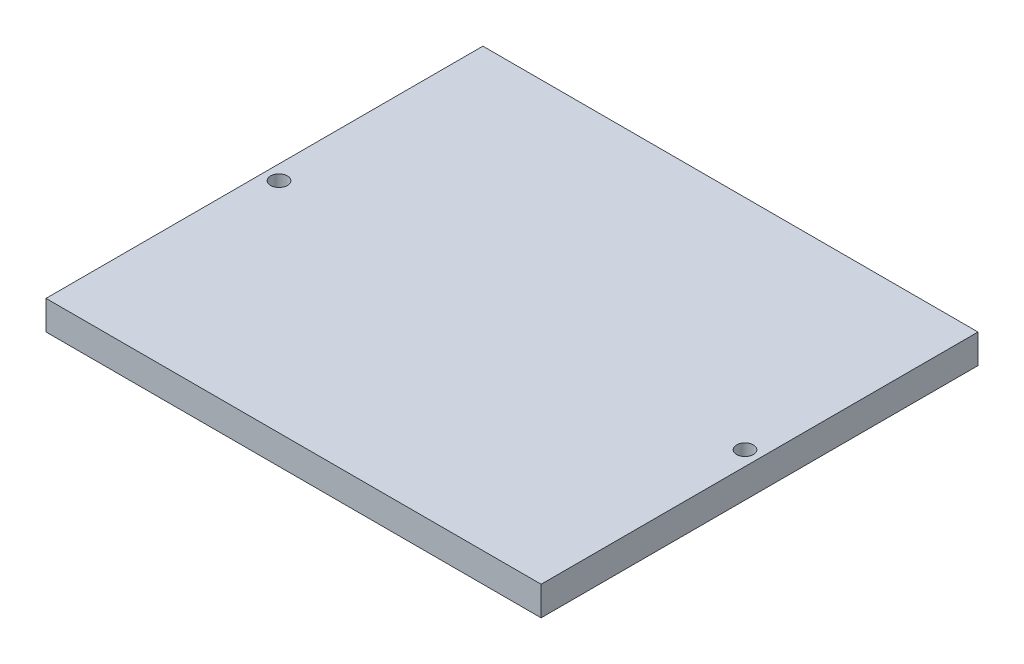
ISO-10303-21;
HEADER;
FILE_DESCRIPTION(('STEP AP214'),'2;1');
FILE_NAME('part.step','',(''),(''),'','','');
FILE_SCHEMA(('AUTOMOTIVE_DESIGN { 1 0 10303 214 1 1 1 1 }'));
ENDSEC;
DATA;
#1=APPLICATION_CONTEXT('core data for automotive mechanical design processes');
#2=APPLICATION_PROTOCOL_DEFINITION('international standard','automotive_design',2000,#1);
#3=PRODUCT_CONTEXT('',#1,'mechanical');
#4=PRODUCT('Part','Part','',(#3));
#5=PRODUCT_RELATED_PRODUCT_CATEGORY('part','',(#4));
#6=PRODUCT_DEFINITION_FORMATION('','',#4);
#7=PRODUCT_DEFINITION_CONTEXT('part definition',#1,'design');
#8=PRODUCT_DEFINITION('design','',#6,#7);
#9=PRODUCT_DEFINITION_SHAPE('','',#8);
#10=(LENGTH_UNIT() NAMED_UNIT(*) SI_UNIT(.MILLI.,.METRE.));
#11=(NAMED_UNIT(*) PLANE_ANGLE_UNIT() SI_UNIT($,.RADIAN.));
#12=(NAMED_UNIT(*) SI_UNIT($,.STERADIAN.) SOLID_ANGLE_UNIT());
#13=UNCERTAINTY_MEASURE_WITH_UNIT(LENGTH_MEASURE(1.E-05),#10,'distance_accuracy_value','');
#14=(GEOMETRIC_REPRESENTATION_CONTEXT(3) GLOBAL_UNCERTAINTY_ASSIGNED_CONTEXT((#13)) GLOBAL_UNIT_ASSIGNED_CONTEXT((#10,
#11,#12)) REPRESENTATION_CONTEXT('',''));
#15=CARTESIAN_POINT('',(0.,0.,0.));
#16=DIRECTION('',(0.,0.,1.));
#17=DIRECTION('',(1.,0.,0.));
#18=AXIS2_PLACEMENT_3D('',#15,#16,#17);
#19=CARTESIAN_POINT('',(-53.975,6.35,-47.625));
#20=DIRECTION('',(1.,0.,0.));
#21=DIRECTION('',(0.,0.,-1.));
#22=AXIS2_PLACEMENT_3D('',#19,#20,#21);
#23=PLANE('',#22);
#24=DIRECTION('',(0.,0.,1.));
#25=VECTOR('',#24,1.);
#26=CARTESIAN_POINT('',(-53.975,0.,-47.625));
#27=LINE('',#26,#25);
#28=CARTESIAN_POINT('',(-53.975,0.,-47.625));
#29=VERTEX_POINT('',#28);
#30=CARTESIAN_POINT('',(-53.975,0.,47.625));
#31=VERTEX_POINT('',#30);
#32=EDGE_CURVE('E98',#29,#31,#27,.T.);
#33=ORIENTED_EDGE('',*,*,#32,.T.);
#34=DIRECTION('',(0.,-1.,0.));
#35=VECTOR('',#34,1.);
#36=CARTESIAN_POINT('',(-53.975,6.35,47.625));
#37=LINE('',#36,#35);
#38=CARTESIAN_POINT('',(-53.975,6.35,47.625));
#39=VERTEX_POINT('',#38);
#40=EDGE_CURVE('E11',#39,#31,#37,.T.);
#41=ORIENTED_EDGE('',*,*,#40,.F.);
#42=DIRECTION('',(0.,0.,1.));
#43=VECTOR('',#42,1.);
#44=CARTESIAN_POINT('',(-53.975,6.35,-47.625));
#45=LINE('',#44,#43);
#46=CARTESIAN_POINT('',(-53.975,6.35,-47.625));
#47=VERTEX_POINT('',#46);
#48=EDGE_CURVE('E85',#47,#39,#45,.T.);
#49=ORIENTED_EDGE('',*,*,#48,.F.);
#50=DIRECTION('',(0.,-1.,0.));
#51=VECTOR('',#50,1.);
#52=CARTESIAN_POINT('',(-53.975,6.35,-47.625));
#53=LINE('',#52,#51);
#54=EDGE_CURVE('E94',#47,#29,#53,.T.);
#55=ORIENTED_EDGE('',*,*,#54,.T.);
#56=EDGE_LOOP('',(#33,#41,#49,#55));
#57=FACE_BOUND('',#56,.T.);
#58=ADVANCED_FACE('F33',(#57),#23,.F.);
#59=CARTESIAN_POINT('',(53.975,6.35,47.625));
#60=DIRECTION('',(0.,0.,-1.));
#61=DIRECTION('',(-1.,0.,0.));
#62=AXIS2_PLACEMENT_3D('',#59,#60,#61);
#63=PLANE('',#62);
#64=DIRECTION('',(1.,0.,0.));
#65=VECTOR('',#64,1.);
#66=CARTESIAN_POINT('',(53.975,0.,47.625));
#67=LINE('',#66,#65);
#68=CARTESIAN_POINT('',(53.975,0.,47.625));
#69=VERTEX_POINT('',#68);
#70=EDGE_CURVE('E89',#31,#69,#67,.T.);
#71=ORIENTED_EDGE('',*,*,#70,.T.);
#72=DIRECTION('',(0.,-1.,0.));
#73=VECTOR('',#72,1.);
#74=CARTESIAN_POINT('',(53.975,6.35,47.625));
#75=LINE('',#74,#73);
#76=CARTESIAN_POINT('',(53.975,6.35,47.625));
#77=VERTEX_POINT('',#76);
#78=EDGE_CURVE('E42',#77,#69,#75,.T.);
#79=ORIENTED_EDGE('',*,*,#78,.F.);
#80=DIRECTION('',(1.,0.,0.));
#81=VECTOR('',#80,1.);
#82=CARTESIAN_POINT('',(53.975,6.35,47.625));
#83=LINE('',#82,#81);
#84=EDGE_CURVE('E80',#39,#77,#83,.T.);
#85=ORIENTED_EDGE('',*,*,#84,.F.);
#86=ORIENTED_EDGE('',*,*,#40,.T.);
#87=EDGE_LOOP('',(#71,#79,#85,#86));
#88=FACE_BOUND('',#87,.T.);
#89=ADVANCED_FACE('F88',(#88),#63,.F.);
#90=CARTESIAN_POINT('',(53.975,6.35,-47.625));
#91=DIRECTION('',(-1.,0.,0.));
#92=DIRECTION('',(0.,0.,1.));
#93=AXIS2_PLACEMENT_3D('',#90,#91,#92);
#94=PLANE('',#93);
#95=DIRECTION('',(0.,0.,-1.));
#96=VECTOR('',#95,1.);
#97=CARTESIAN_POINT('',(53.975,0.,-47.625));
#98=LINE('',#97,#96);
#99=CARTESIAN_POINT('',(53.975,0.,-47.625));
#100=VERTEX_POINT('',#99);
#101=EDGE_CURVE('E67',#69,#100,#98,.T.);
#102=ORIENTED_EDGE('',*,*,#101,.T.);
#103=DIRECTION('',(0.,-1.,0.));
#104=VECTOR('',#103,1.);
#105=CARTESIAN_POINT('',(53.975,6.35,-47.625));
#106=LINE('',#105,#104);
#107=CARTESIAN_POINT('',(53.975,6.35,-47.625));
#108=VERTEX_POINT('',#107);
#109=EDGE_CURVE('E90',#108,#100,#106,.T.);
#110=ORIENTED_EDGE('',*,*,#109,.F.);
#111=DIRECTION('',(0.,0.,-1.));
#112=VECTOR('',#111,1.);
#113=CARTESIAN_POINT('',(53.975,6.35,-47.625));
#114=LINE('',#113,#112);
#115=EDGE_CURVE('E83',#77,#108,#114,.T.);
#116=ORIENTED_EDGE('',*,*,#115,.F.);
#117=ORIENTED_EDGE('',*,*,#78,.T.);
#118=EDGE_LOOP('',(#102,#110,#116,#117));
#119=FACE_BOUND('',#118,.T.);
#120=ADVANCED_FACE('F92',(#119),#94,.F.);
#121=CARTESIAN_POINT('',(53.975,6.35,-47.625));
#122=DIRECTION('',(0.,0.,1.));
#123=DIRECTION('',(1.,0.,0.));
#124=AXIS2_PLACEMENT_3D('',#121,#122,#123);
#125=PLANE('',#124);
#126=DIRECTION('',(-1.,0.,0.));
#127=VECTOR('',#126,1.);
#128=CARTESIAN_POINT('',(53.975,0.,-47.625));
#129=LINE('',#128,#127);
#130=EDGE_CURVE('E73',#100,#29,#129,.T.);
#131=ORIENTED_EDGE('',*,*,#130,.T.);
#132=ORIENTED_EDGE('',*,*,#54,.F.);
#133=DIRECTION('',(-1.,0.,0.));
#134=VECTOR('',#133,1.);
#135=CARTESIAN_POINT('',(53.975,6.35,-47.625));
#136=LINE('',#135,#134);
#137=EDGE_CURVE('E50',#108,#47,#136,.T.);
#138=ORIENTED_EDGE('',*,*,#137,.F.);
#139=ORIENTED_EDGE('',*,*,#109,.T.);
#140=EDGE_LOOP('',(#131,#132,#138,#139));
#141=FACE_BOUND('',#140,.T.);
#142=ADVANCED_FACE('F106',(#141),#125,.F.);
#143=CARTESIAN_POINT('',(-53.975,6.35,47.625));
#144=DIRECTION('',(0.,-1.,0.));
#145=DIRECTION('',(0.,0.,-1.));
#146=AXIS2_PLACEMENT_3D('',#143,#144,#145);
#147=PLANE('',#146);
#148=CARTESIAN_POINT('',(-50.8,6.35,0.));
#149=DIRECTION('',(0.,1.,0.));
#150=DIRECTION('',(0.,0.,1.));
#151=AXIS2_PLACEMENT_3D('',#148,#149,#150);
#152=CIRCLE('',#151,1.8288);
#153=CARTESIAN_POINT('',(-50.8,6.35,1.8288));
#154=VERTEX_POINT('',#153);
#155=EDGE_CURVE('E117',#154,#154,#152,.T.);
#156=ORIENTED_EDGE('',*,*,#155,.F.);
#157=EDGE_LOOP('',(#156));
#158=FACE_BOUND('',#157,.T.);
#159=CARTESIAN_POINT('',(50.8,6.35,0.));
#160=DIRECTION('',(0.,1.,0.));
#161=DIRECTION('',(0.,0.,1.));
#162=AXIS2_PLACEMENT_3D('',#159,#160,#161);
#163=CIRCLE('',#162,1.8288);
#164=CARTESIAN_POINT('',(50.8,6.35,1.8288));
#165=VERTEX_POINT('',#164);
#166=EDGE_CURVE('E114',#165,#165,#163,.T.);
#167=ORIENTED_EDGE('',*,*,#166,.F.);
#168=EDGE_LOOP('',(#167));
#169=FACE_BOUND('',#168,.T.);
#170=ORIENTED_EDGE('',*,*,#48,.T.);
#171=ORIENTED_EDGE('',*,*,#84,.T.);
#172=ORIENTED_EDGE('',*,*,#115,.T.);
#173=ORIENTED_EDGE('',*,*,#137,.T.);
#174=EDGE_LOOP('',(#170,#171,#172,#173));
#175=FACE_BOUND('',#174,.T.);
#176=ADVANCED_FACE('F81',(#158,#169,#175),#147,.F.);
#177=CARTESIAN_POINT('',(-53.975,0.,47.625));
#178=DIRECTION('',(0.,-1.,0.));
#179=DIRECTION('',(0.,0.,-1.));
#180=AXIS2_PLACEMENT_3D('',#177,#178,#179);
#181=PLANE('',#180);
#182=CARTESIAN_POINT('',(-50.8,0.,0.));
#183=DIRECTION('',(0.,-1.,0.));
#184=DIRECTION('',(0.,0.,-1.));
#185=AXIS2_PLACEMENT_3D('',#182,#183,#184);
#186=CIRCLE('',#185,1.8288);
#187=CARTESIAN_POINT('',(-50.8,0.,-1.8288));
#188=VERTEX_POINT('',#187);
#189=EDGE_CURVE('E36',#188,#188,#186,.T.);
#190=ORIENTED_EDGE('',*,*,#189,.F.);
#191=EDGE_LOOP('',(#190));
#192=FACE_BOUND('',#191,.T.);
#193=CARTESIAN_POINT('',(50.8,0.,0.));
#194=DIRECTION('',(0.,-1.,0.));
#195=DIRECTION('',(0.,0.,-1.));
#196=AXIS2_PLACEMENT_3D('',#193,#194,#195);
#197=CIRCLE('',#196,1.8288);
#198=CARTESIAN_POINT('',(50.8,0.,-1.8288));
#199=VERTEX_POINT('',#198);
#200=EDGE_CURVE('E101',#199,#199,#197,.T.);
#201=ORIENTED_EDGE('',*,*,#200,.F.);
#202=EDGE_LOOP('',(#201));
#203=FACE_BOUND('',#202,.T.);
#204=ORIENTED_EDGE('',*,*,#32,.F.);
#205=ORIENTED_EDGE('',*,*,#130,.F.);
#206=ORIENTED_EDGE('',*,*,#101,.F.);
#207=ORIENTED_EDGE('',*,*,#70,.F.);
#208=EDGE_LOOP('',(#204,#205,#206,#207));
#209=FACE_BOUND('',#208,.T.);
#210=ADVANCED_FACE('F109',(#192,#203,#209),#181,.T.);
#211=CARTESIAN_POINT('',(50.8,6.35,0.));
#212=DIRECTION('',(0.,1.,0.));
#213=DIRECTION('',(0.,0.,1.));
#214=AXIS2_PLACEMENT_3D('',#211,#212,#213);
#215=CYLINDRICAL_SURFACE('',#214,1.8288);
#216=ORIENTED_EDGE('',*,*,#200,.T.);
#217=EDGE_LOOP('',(#216));
#218=FACE_BOUND('',#217,.T.);
#219=ORIENTED_EDGE('',*,*,#166,.T.);
#220=EDGE_LOOP('',(#219));
#221=FACE_BOUND('',#220,.T.);
#222=ADVANCED_FACE('F128',(#218,#221),#215,.F.);
#223=CARTESIAN_POINT('',(-50.8,6.35,0.));
#224=DIRECTION('',(0.,1.,0.));
#225=DIRECTION('',(0.,0.,1.));
#226=AXIS2_PLACEMENT_3D('',#223,#224,#225);
#227=CYLINDRICAL_SURFACE('',#226,1.8288);
#228=ORIENTED_EDGE('',*,*,#189,.T.);
#229=EDGE_LOOP('',(#228));
#230=FACE_BOUND('',#229,.T.);
#231=ORIENTED_EDGE('',*,*,#155,.T.);
#232=EDGE_LOOP('',(#231));
#233=FACE_BOUND('',#232,.T.);
#234=ADVANCED_FACE('F124',(#230,#233),#227,.F.);
#235=CLOSED_SHELL('',(#58,#89,#120,#142,#176,#210,#222,#234));
#236=MANIFOLD_SOLID_BREP('B2',#235);
#237=ADVANCED_BREP_SHAPE_REPRESENTATION('',(#18,#236),#14);
#238=SHAPE_DEFINITION_REPRESENTATION(#9,#237);
ENDSEC;
END-ISO-10303-21;
